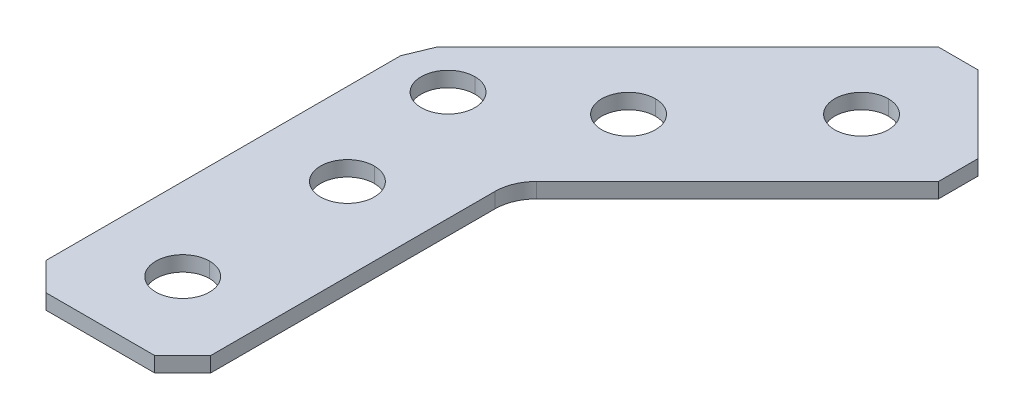
ISO-10303-21;
HEADER;
FILE_DESCRIPTION(('STEP AP214'),'2;1');
FILE_NAME('part.step','',(''),(''),'','','');
FILE_SCHEMA(('AUTOMOTIVE_DESIGN { 1 0 10303 214 1 1 1 1 }'));
ENDSEC;
DATA;
#1=APPLICATION_CONTEXT('core data for automotive mechanical design processes');
#2=APPLICATION_PROTOCOL_DEFINITION('international standard','automotive_design',2000,#1);
#3=PRODUCT_CONTEXT('',#1,'mechanical');
#4=PRODUCT('Part','Part','',(#3));
#5=PRODUCT_RELATED_PRODUCT_CATEGORY('part','',(#4));
#6=PRODUCT_DEFINITION_FORMATION('','',#4);
#7=PRODUCT_DEFINITION_CONTEXT('part definition',#1,'design');
#8=PRODUCT_DEFINITION('design','',#6,#7);
#9=PRODUCT_DEFINITION_SHAPE('','',#8);
#10=(LENGTH_UNIT() NAMED_UNIT(*) SI_UNIT(.MILLI.,.METRE.));
#11=(NAMED_UNIT(*) PLANE_ANGLE_UNIT() SI_UNIT($,.RADIAN.));
#12=(NAMED_UNIT(*) SI_UNIT($,.STERADIAN.) SOLID_ANGLE_UNIT());
#13=UNCERTAINTY_MEASURE_WITH_UNIT(LENGTH_MEASURE(1.E-05),#10,'distance_accuracy_value','');
#14=(GEOMETRIC_REPRESENTATION_CONTEXT(3) GLOBAL_UNCERTAINTY_ASSIGNED_CONTEXT((#13)) GLOBAL_UNIT_ASSIGNED_CONTEXT((#10,
#11,#12)) REPRESENTATION_CONTEXT('',''));
#15=CARTESIAN_POINT('',(0.,0.,0.));
#16=DIRECTION('',(0.,0.,1.));
#17=DIRECTION('',(1.,0.,0.));
#18=AXIS2_PLACEMENT_3D('',#15,#16,#17);
#19=CARTESIAN_POINT('',(-4.191,1.1684,12.7));
#20=DIRECTION('',(0.707106781186549,0.,-0.707106781186546));
#21=DIRECTION('',(0.,-1.,0.));
#22=AXIS2_PLACEMENT_3D('',#19,#20,#21);
#23=PLANE('',#22);
#24=DIRECTION('',(0.707106781186547,0.,0.707106781186549));
#25=VECTOR('',#24,1.);
#26=CARTESIAN_POINT('',(-4.191,1.1684,12.7));
#27=LINE('',#26,#25);
#28=CARTESIAN_POINT('',(-6.35,1.1684,10.541));
#29=VERTEX_POINT('',#28);
#30=CARTESIAN_POINT('',(-4.191,1.1684,12.7));
#31=VERTEX_POINT('',#30);
#32=EDGE_CURVE('E223',#29,#31,#27,.T.);
#33=ORIENTED_EDGE('',*,*,#32,.F.);
#34=DIRECTION('',(0.,1.,0.));
#35=VECTOR('',#34,1.);
#36=CARTESIAN_POINT('',(-6.35,1.1684,10.541));
#37=LINE('',#36,#35);
#38=CARTESIAN_POINT('',(-6.35,0.,10.541));
#39=VERTEX_POINT('',#38);
#40=EDGE_CURVE('E313',#39,#29,#37,.T.);
#41=ORIENTED_EDGE('',*,*,#40,.F.);
#42=DIRECTION('',(-0.707106781186547,0.,-0.707106781186549));
#43=VECTOR('',#42,1.);
#44=CARTESIAN_POINT('',(-5.2705,0.,11.6205));
#45=LINE('',#44,#43);
#46=CARTESIAN_POINT('',(-4.191,0.,12.7));
#47=VERTEX_POINT('',#46);
#48=EDGE_CURVE('E226',#47,#39,#45,.T.);
#49=ORIENTED_EDGE('',*,*,#48,.F.);
#50=DIRECTION('',(0.,-1.,0.));
#51=VECTOR('',#50,1.);
#52=CARTESIAN_POINT('',(-4.191,1.1684,12.7));
#53=LINE('',#52,#51);
#54=EDGE_CURVE('E10',#31,#47,#53,.T.);
#55=ORIENTED_EDGE('',*,*,#54,.F.);
#56=EDGE_LOOP('',(#33,#41,#49,#55));
#57=FACE_BOUND('',#56,.T.);
#58=ADVANCED_FACE('F15',(#57),#23,.F.);
#59=CARTESIAN_POINT('',(-6.35,1.1684,12.7));
#60=DIRECTION('',(0.,0.,-1.));
#61=DIRECTION('',(0.,-1.,0.));
#62=AXIS2_PLACEMENT_3D('',#59,#60,#61);
#63=PLANE('',#62);
#64=DIRECTION('',(1.,0.,0.));
#65=VECTOR('',#64,1.);
#66=CARTESIAN_POINT('',(-6.35,1.1684,12.7));
#67=LINE('',#66,#65);
#68=CARTESIAN_POINT('',(4.191,1.1684,12.7));
#69=VERTEX_POINT('',#68);
#70=EDGE_CURVE('E231',#31,#69,#67,.T.);
#71=ORIENTED_EDGE('',*,*,#70,.F.);
#72=ORIENTED_EDGE('',*,*,#54,.T.);
#73=DIRECTION('',(1.,0.,0.));
#74=VECTOR('',#73,1.);
#75=CARTESIAN_POINT('',(-6.35,0.,12.7));
#76=LINE('',#75,#74);
#77=CARTESIAN_POINT('',(4.191,0.,12.7));
#78=VERTEX_POINT('',#77);
#79=EDGE_CURVE('E264',#47,#78,#76,.T.);
#80=ORIENTED_EDGE('',*,*,#79,.T.);
#81=DIRECTION('',(0.,1.,0.));
#82=VECTOR('',#81,1.);
#83=CARTESIAN_POINT('',(4.191,1.1684,12.7));
#84=LINE('',#83,#82);
#85=EDGE_CURVE('E233',#78,#69,#84,.T.);
#86=ORIENTED_EDGE('',*,*,#85,.T.);
#87=EDGE_LOOP('',(#71,#72,#80,#86));
#88=FACE_BOUND('',#87,.T.);
#89=ADVANCED_FACE('F232',(#88),#63,.F.);
#90=CARTESIAN_POINT('',(9.525,1.1684,-11.3848719394654));
#91=DIRECTION('',(0.,1.,0.));
#92=DIRECTION('',(0.,0.,1.));
#93=AXIS2_PLACEMENT_3D('',#90,#91,#92);
#94=CYLINDRICAL_SURFACE('',#93,3.175);
#95=CARTESIAN_POINT('',(9.525,1.1684,-11.3848719394654));
#96=DIRECTION('',(0.,-1.,0.));
#97=DIRECTION('',(0.,0.,-1.));
#98=AXIS2_PLACEMENT_3D('',#95,#96,#97);
#99=CIRCLE('',#98,3.175);
#100=CARTESIAN_POINT('',(6.35,1.1684,-11.3848719394654));
#101=VERTEX_POINT('',#100);
#102=CARTESIAN_POINT('',(7.27993596973271,1.1684,-13.6299359697327));
#103=VERTEX_POINT('',#102);
#104=EDGE_CURVE('E385',#101,#103,#99,.T.);
#105=ORIENTED_EDGE('',*,*,#104,.F.);
#106=DIRECTION('',(0.,1.,0.));
#107=VECTOR('',#106,1.);
#108=CARTESIAN_POINT('',(6.35,1.1684,-11.3848719394654));
#109=LINE('',#108,#107);
#110=CARTESIAN_POINT('',(6.35,0.,-11.3848719394654));
#111=VERTEX_POINT('',#110);
#112=EDGE_CURVE('E415',#111,#101,#109,.T.);
#113=ORIENTED_EDGE('',*,*,#112,.F.);
#114=CARTESIAN_POINT('',(9.525,0.,-11.3848719394654));
#115=DIRECTION('',(0.,1.,0.));
#116=DIRECTION('',(0.,0.,-1.));
#117=AXIS2_PLACEMENT_3D('',#114,#115,#116);
#118=CIRCLE('',#117,3.175);
#119=CARTESIAN_POINT('',(7.27993596973271,0.,-13.6299359697327));
#120=VERTEX_POINT('',#119);
#121=EDGE_CURVE('E326',#120,#111,#118,.T.);
#122=ORIENTED_EDGE('',*,*,#121,.F.);
#123=DIRECTION('',(0.,-1.,0.));
#124=VECTOR('',#123,1.);
#125=CARTESIAN_POINT('',(7.27993596973272,0.,-13.6299359697327));
#126=LINE('',#125,#124);
#127=EDGE_CURVE('E379',#103,#120,#126,.T.);
#128=ORIENTED_EDGE('',*,*,#127,.F.);
#129=EDGE_LOOP('',(#105,#113,#122,#128));
#130=FACE_BOUND('',#129,.T.);
#131=ADVANCED_FACE('F476',(#130),#94,.F.);
#132=CARTESIAN_POINT('',(-2.08546691384424,1.1684,-16.1940848006638));
#133=DIRECTION('',(0.,-1.,0.));
#134=DIRECTION('',(0.,0.,-1.));
#135=AXIS2_PLACEMENT_3D('',#132,#133,#134);
#136=CYLINDRICAL_SURFACE('',#135,2.0701);
#137=CARTESIAN_POINT('',(-2.08546691384424,1.1684,-16.1940848006638));
#138=DIRECTION('',(0.,1.,0.));
#139=DIRECTION('',(0.,0.,1.));
#140=AXIS2_PLACEMENT_3D('',#137,#138,#139);
#141=CIRCLE('',#140,2.0701);
#142=CARTESIAN_POINT('',(-2.08546691384424,1.1684,-18.2641848006638));
#143=VERTEX_POINT('',#142);
#144=CARTESIAN_POINT('',(-2.08546691384424,1.1684,-14.1239848006638));
#145=VERTEX_POINT('',#144);
#146=EDGE_CURVE('E346',#143,#145,#141,.T.);
#147=ORIENTED_EDGE('',*,*,#146,.T.);
#148=DIRECTION('',(0.,-1.,0.));
#149=VECTOR('',#148,1.);
#150=CARTESIAN_POINT('',(-2.08546691384424,1.1684,-14.1239848006638));
#151=LINE('',#150,#149);
#152=CARTESIAN_POINT('',(-2.08546691384424,0.,-14.1239848006638));
#153=VERTEX_POINT('',#152);
#154=EDGE_CURVE('E376',#145,#153,#151,.T.);
#155=ORIENTED_EDGE('',*,*,#154,.T.);
#156=CARTESIAN_POINT('',(-2.08546691384424,0.,-16.1940848006638));
#157=DIRECTION('',(0.,1.,0.));
#158=DIRECTION('',(0.,0.,1.));
#159=AXIS2_PLACEMENT_3D('',#156,#157,#158);
#160=CIRCLE('',#159,2.0701);
#161=CARTESIAN_POINT('',(-2.08546691384424,0.,-18.2641848006638));
#162=VERTEX_POINT('',#161);
#163=EDGE_CURVE('E370',#162,#153,#160,.T.);
#164=ORIENTED_EDGE('',*,*,#163,.F.);
#165=DIRECTION('',(0.,-1.,0.));
#166=VECTOR('',#165,1.);
#167=CARTESIAN_POINT('',(-2.08546691384424,1.1684,-18.2641848006638));
#168=LINE('',#167,#166);
#169=EDGE_CURVE('E26',#143,#162,#168,.T.);
#170=ORIENTED_EDGE('',*,*,#169,.F.);
#171=EDGE_LOOP('',(#147,#155,#164,#170));
#172=FACE_BOUND('',#171,.T.);
#173=ADVANCED_FACE('F520',(#172),#136,.F.);
#174=CARTESIAN_POINT('',(6.35,1.1684,-21.6802561210692));
#175=DIRECTION('',(0.,-1.,0.));
#176=DIRECTION('',(0.,0.,-1.));
#177=AXIS2_PLACEMENT_3D('',#174,#175,#176);
#178=CYLINDRICAL_SURFACE('',#177,2.0701);
#179=CARTESIAN_POINT('',(6.35,1.1684,-21.6802561210692));
#180=DIRECTION('',(0.,1.,0.));
#181=DIRECTION('',(0.,0.,1.));
#182=AXIS2_PLACEMENT_3D('',#179,#180,#181);
#183=CIRCLE('',#182,2.0701);
#184=CARTESIAN_POINT('',(6.35,1.1684,-23.7503561210692));
#185=VERTEX_POINT('',#184);
#186=CARTESIAN_POINT('',(6.35,1.1684,-19.6101561210692));
#187=VERTEX_POINT('',#186);
#188=EDGE_CURVE('E259',#185,#187,#183,.T.);
#189=ORIENTED_EDGE('',*,*,#188,.T.);
#190=DIRECTION('',(0.,-1.,0.));
#191=VECTOR('',#190,1.);
#192=CARTESIAN_POINT('',(6.35,1.1684,-19.6101561210692));
#193=LINE('',#192,#191);
#194=CARTESIAN_POINT('',(6.35,0.,-19.6101561210692));
#195=VERTEX_POINT('',#194);
#196=EDGE_CURVE('E276',#187,#195,#193,.T.);
#197=ORIENTED_EDGE('',*,*,#196,.T.);
#198=CARTESIAN_POINT('',(6.35,0.,-21.6802561210692));
#199=DIRECTION('',(0.,1.,0.));
#200=DIRECTION('',(0.,0.,1.));
#201=AXIS2_PLACEMENT_3D('',#198,#199,#200);
#202=CIRCLE('',#201,2.0701);
#203=CARTESIAN_POINT('',(6.35,0.,-23.7503561210692));
#204=VERTEX_POINT('',#203);
#205=EDGE_CURVE('E285',#204,#195,#202,.T.);
#206=ORIENTED_EDGE('',*,*,#205,.F.);
#207=DIRECTION('',(0.,-1.,0.));
#208=VECTOR('',#207,1.);
#209=CARTESIAN_POINT('',(6.35,1.1684,-23.7503561210692));
#210=LINE('',#209,#208);
#211=EDGE_CURVE('E278',#185,#204,#210,.T.);
#212=ORIENTED_EDGE('',*,*,#211,.F.);
#213=EDGE_LOOP('',(#189,#197,#206,#212));
#214=FACE_BOUND('',#213,.T.);
#215=ADVANCED_FACE('F523',(#214),#178,.F.);
#216=CARTESIAN_POINT('',(-2.08546691384424,1.1684,-16.1940848006638));
#217=DIRECTION('',(0.,-1.,0.));
#218=DIRECTION('',(0.,0.,-1.));
#219=AXIS2_PLACEMENT_3D('',#216,#217,#218);
#220=CYLINDRICAL_SURFACE('',#219,2.0701);
#221=ORIENTED_EDGE('',*,*,#154,.F.);
#222=CARTESIAN_POINT('',(-2.08546691384424,1.1684,-16.1940848006638));
#223=DIRECTION('',(0.,1.,0.));
#224=DIRECTION('',(0.,0.,1.));
#225=AXIS2_PLACEMENT_3D('',#222,#223,#224);
#226=CIRCLE('',#225,2.0701);
#227=EDGE_CURVE('E393',#145,#143,#226,.T.);
#228=ORIENTED_EDGE('',*,*,#227,.T.);
#229=ORIENTED_EDGE('',*,*,#169,.T.);
#230=CARTESIAN_POINT('',(-2.08546691384424,0.,-16.1940848006638));
#231=DIRECTION('',(0.,1.,0.));
#232=DIRECTION('',(0.,0.,1.));
#233=AXIS2_PLACEMENT_3D('',#230,#231,#232);
#234=CIRCLE('',#233,2.0701);
#235=EDGE_CURVE('E254',#153,#162,#234,.T.);
#236=ORIENTED_EDGE('',*,*,#235,.F.);
#237=EDGE_LOOP('',(#221,#228,#229,#236));
#238=FACE_BOUND('',#237,.T.);
#239=ADVANCED_FACE('F525',(#238),#220,.F.);
#240=CARTESIAN_POINT('',(0.,1.1684,6.35));
#241=DIRECTION('',(0.,-1.,0.));
#242=DIRECTION('',(0.,0.,-1.));
#243=AXIS2_PLACEMENT_3D('',#240,#241,#242);
#244=CYLINDRICAL_SURFACE('',#243,2.0701);
#245=CARTESIAN_POINT('',(0.,1.1684,6.35));
#246=DIRECTION('',(0.,1.,0.));
#247=DIRECTION('',(0.,0.,1.));
#248=AXIS2_PLACEMENT_3D('',#245,#246,#247);
#249=CIRCLE('',#248,2.0701);
#250=CARTESIAN_POINT('',(0.,1.1684,4.2799));
#251=VERTEX_POINT('',#250);
#252=CARTESIAN_POINT('',(0.,1.1684,8.4201));
#253=VERTEX_POINT('',#252);
#254=EDGE_CURVE('E347',#251,#253,#249,.T.);
#255=ORIENTED_EDGE('',*,*,#254,.T.);
#256=DIRECTION('',(0.,-1.,0.));
#257=VECTOR('',#256,1.);
#258=CARTESIAN_POINT('',(0.,1.1684,8.4201));
#259=LINE('',#258,#257);
#260=CARTESIAN_POINT('',(0.,0.,8.4201));
#261=VERTEX_POINT('',#260);
#262=EDGE_CURVE('E312',#253,#261,#259,.T.);
#263=ORIENTED_EDGE('',*,*,#262,.T.);
#264=CARTESIAN_POINT('',(0.,0.,6.35));
#265=DIRECTION('',(0.,1.,0.));
#266=DIRECTION('',(0.,0.,1.));
#267=AXIS2_PLACEMENT_3D('',#264,#265,#266);
#268=CIRCLE('',#267,2.0701);
#269=CARTESIAN_POINT('',(0.,0.,4.2799));
#270=VERTEX_POINT('',#269);
#271=EDGE_CURVE('E284',#270,#261,#268,.T.);
#272=ORIENTED_EDGE('',*,*,#271,.F.);
#273=DIRECTION('',(0.,-1.,0.));
#274=VECTOR('',#273,1.);
#275=CARTESIAN_POINT('',(0.,1.1684,4.2799));
#276=LINE('',#275,#274);
#277=EDGE_CURVE('E319',#251,#270,#276,.T.);
#278=ORIENTED_EDGE('',*,*,#277,.F.);
#279=EDGE_LOOP('',(#255,#263,#272,#278));
#280=FACE_BOUND('',#279,.T.);
#281=ADVANCED_FACE('F528',(#280),#244,.F.);
#282=CARTESIAN_POINT('',(15.3302561210692,1.1684,-30.6605122421383));
#283=DIRECTION('',(0.,-1.,0.));
#284=DIRECTION('',(0.,0.,-1.));
#285=AXIS2_PLACEMENT_3D('',#282,#283,#284);
#286=CYLINDRICAL_SURFACE('',#285,2.0701);
#287=DIRECTION('',(0.,-1.,0.));
#288=VECTOR('',#287,1.);
#289=CARTESIAN_POINT('',(15.3302561210692,1.1684,-28.5904122421383));
#290=LINE('',#289,#288);
#291=CARTESIAN_POINT('',(15.3302561210692,1.1684,-28.5904122421383));
#292=VERTEX_POINT('',#291);
#293=CARTESIAN_POINT('',(15.3302561210692,0.,-28.5904122421383));
#294=VERTEX_POINT('',#293);
#295=EDGE_CURVE('E41',#292,#294,#290,.T.);
#296=ORIENTED_EDGE('',*,*,#295,.F.);
#297=CARTESIAN_POINT('',(15.3302561210692,1.1684,-30.6605122421383));
#298=DIRECTION('',(0.,1.,0.));
#299=DIRECTION('',(0.,0.,1.));
#300=AXIS2_PLACEMENT_3D('',#297,#298,#299);
#301=CIRCLE('',#300,2.0701);
#302=CARTESIAN_POINT('',(15.3302561210692,1.1684,-32.7306122421383));
#303=VERTEX_POINT('',#302);
#304=EDGE_CURVE('E333',#292,#303,#301,.T.);
#305=ORIENTED_EDGE('',*,*,#304,.T.);
#306=DIRECTION('',(0.,-1.,0.));
#307=VECTOR('',#306,1.);
#308=CARTESIAN_POINT('',(15.3302561210692,1.1684,-32.7306122421383));
#309=LINE('',#308,#307);
#310=CARTESIAN_POINT('',(15.3302561210692,0.,-32.7306122421383));
#311=VERTEX_POINT('',#310);
#312=EDGE_CURVE('E273',#303,#311,#309,.T.);
#313=ORIENTED_EDGE('',*,*,#312,.T.);
#314=CARTESIAN_POINT('',(15.3302561210692,0.,-30.6605122421383));
#315=DIRECTION('',(0.,1.,0.));
#316=DIRECTION('',(0.,0.,1.));
#317=AXIS2_PLACEMENT_3D('',#314,#315,#316);
#318=CIRCLE('',#317,2.0701);
#319=EDGE_CURVE('E297',#294,#311,#318,.T.);
#320=ORIENTED_EDGE('',*,*,#319,.F.);
#321=EDGE_LOOP('',(#296,#305,#313,#320));
#322=FACE_BOUND('',#321,.T.);
#323=ADVANCED_FACE('F510',(#322),#286,.F.);
#324=CARTESIAN_POINT('',(24.3105122421383,1.1684,-30.6605122421382));
#325=DIRECTION('',(-0.707106781186546,0.,-0.707106781186549));
#326=DIRECTION('',(-0.707106781186549,0.,0.707106781186546));
#327=AXIS2_PLACEMENT_3D('',#324,#325,#326);
#328=PLANE('',#327);
#329=DIRECTION('',(0.707106781186549,0.,-0.707106781186546));
#330=VECTOR('',#329,1.);
#331=CARTESIAN_POINT('',(24.3105122421383,0.,-30.6605122421382));
#332=LINE('',#331,#330);
#333=CARTESIAN_POINT('',(22.7838687015565,0.,-29.1338687015565));
#334=VERTEX_POINT('',#333);
#335=EDGE_CURVE('E289',#120,#334,#332,.T.);
#336=ORIENTED_EDGE('',*,*,#335,.T.);
#337=DIRECTION('',(0.,1.,0.));
#338=VECTOR('',#337,1.);
#339=CARTESIAN_POINT('',(22.7838687015565,1.1684,-29.1338687015565));
#340=LINE('',#339,#338);
#341=CARTESIAN_POINT('',(22.7838687015565,1.1684,-29.1338687015565));
#342=VERTEX_POINT('',#341);
#343=EDGE_CURVE('E339',#334,#342,#340,.T.);
#344=ORIENTED_EDGE('',*,*,#343,.T.);
#345=DIRECTION('',(0.707106781186549,0.,-0.707106781186546));
#346=VECTOR('',#345,1.);
#347=CARTESIAN_POINT('',(24.3105122421383,1.1684,-30.6605122421382));
#348=LINE('',#347,#346);
#349=EDGE_CURVE('E293',#103,#342,#348,.T.);
#350=ORIENTED_EDGE('',*,*,#349,.F.);
#351=ORIENTED_EDGE('',*,*,#127,.T.);
#352=EDGE_LOOP('',(#336,#344,#350,#351));
#353=FACE_BOUND('',#352,.T.);
#354=ADVANCED_FACE('F468',(#353),#328,.F.);
#355=CARTESIAN_POINT('',(6.35,1.1684,-12.7));
#356=DIRECTION('',(-1.,0.,0.));
#357=DIRECTION('',(0.,1.,0.));
#358=AXIS2_PLACEMENT_3D('',#355,#356,#357);
#359=PLANE('',#358);
#360=DIRECTION('',(0.,0.,-1.));
#361=VECTOR('',#360,1.);
#362=CARTESIAN_POINT('',(6.35,1.1684,-12.7));
#363=LINE('',#362,#361);
#364=CARTESIAN_POINT('',(6.35,1.1684,10.541));
#365=VERTEX_POINT('',#364);
#366=EDGE_CURVE('E365',#365,#101,#363,.T.);
#367=ORIENTED_EDGE('',*,*,#366,.F.);
#368=DIRECTION('',(0.,-1.,0.));
#369=VECTOR('',#368,1.);
#370=CARTESIAN_POINT('',(6.35,1.1684,10.541));
#371=LINE('',#370,#369);
#372=CARTESIAN_POINT('',(6.35,0.,10.541));
#373=VERTEX_POINT('',#372);
#374=EDGE_CURVE('E19',#365,#373,#371,.T.);
#375=ORIENTED_EDGE('',*,*,#374,.T.);
#376=DIRECTION('',(0.,0.,-1.));
#377=VECTOR('',#376,1.);
#378=CARTESIAN_POINT('',(6.35,0.,-12.7));
#379=LINE('',#378,#377);
#380=EDGE_CURVE('E322',#373,#111,#379,.T.);
#381=ORIENTED_EDGE('',*,*,#380,.T.);
#382=ORIENTED_EDGE('',*,*,#112,.T.);
#383=EDGE_LOOP('',(#367,#375,#381,#382));
#384=FACE_BOUND('',#383,.T.);
#385=ADVANCED_FACE('F501',(#384),#359,.F.);
#386=CARTESIAN_POINT('',(6.35,1.1684,10.541));
#387=DIRECTION('',(-0.707106781186546,0.,-0.707106781186549));
#388=DIRECTION('',(-0.707106781186549,0.,0.707106781186546));
#389=AXIS2_PLACEMENT_3D('',#386,#387,#388);
#390=PLANE('',#389);
#391=DIRECTION('',(0.707106781186549,0.,-0.707106781186546));
#392=VECTOR('',#391,1.);
#393=CARTESIAN_POINT('',(6.35,1.1684,10.541));
#394=LINE('',#393,#392);
#395=EDGE_CURVE('E237',#69,#365,#394,.T.);
#396=ORIENTED_EDGE('',*,*,#395,.F.);
#397=ORIENTED_EDGE('',*,*,#85,.F.);
#398=DIRECTION('',(-0.707106781186549,0.,0.707106781186546));
#399=VECTOR('',#398,1.);
#400=CARTESIAN_POINT('',(-1.0795,0.,17.9705));
#401=LINE('',#400,#399);
#402=EDGE_CURVE('E267',#373,#78,#401,.T.);
#403=ORIENTED_EDGE('',*,*,#402,.F.);
#404=ORIENTED_EDGE('',*,*,#374,.F.);
#405=EDGE_LOOP('',(#396,#397,#403,#404));
#406=FACE_BOUND('',#405,.T.);
#407=ADVANCED_FACE('F499',(#406),#390,.F.);
#408=CARTESIAN_POINT('',(6.35,1.1684,-21.6802561210692));
#409=DIRECTION('',(0.,-1.,0.));
#410=DIRECTION('',(0.,0.,-1.));
#411=AXIS2_PLACEMENT_3D('',#408,#409,#410);
#412=CYLINDRICAL_SURFACE('',#411,2.0701);
#413=ORIENTED_EDGE('',*,*,#196,.F.);
#414=CARTESIAN_POINT('',(6.35,1.1684,-21.6802561210692));
#415=DIRECTION('',(0.,1.,0.));
#416=DIRECTION('',(0.,0.,1.));
#417=AXIS2_PLACEMENT_3D('',#414,#415,#416);
#418=CIRCLE('',#417,2.0701);
#419=EDGE_CURVE('E263',#187,#185,#418,.T.);
#420=ORIENTED_EDGE('',*,*,#419,.T.);
#421=ORIENTED_EDGE('',*,*,#211,.T.);
#422=CARTESIAN_POINT('',(6.35,0.,-21.6802561210692));
#423=DIRECTION('',(0.,1.,0.));
#424=DIRECTION('',(0.,0.,1.));
#425=AXIS2_PLACEMENT_3D('',#422,#423,#424);
#426=CIRCLE('',#425,2.0701);
#427=EDGE_CURVE('E280',#195,#204,#426,.T.);
#428=ORIENTED_EDGE('',*,*,#427,.F.);
#429=EDGE_LOOP('',(#413,#420,#421,#428));
#430=FACE_BOUND('',#429,.T.);
#431=ADVANCED_FACE('F17',(#430),#412,.F.);
#432=CARTESIAN_POINT('',(0.,1.1684,-6.35000000000009));
#433=DIRECTION('',(0.,-1.,0.));
#434=DIRECTION('',(0.,0.,-1.));
#435=AXIS2_PLACEMENT_3D('',#432,#433,#434);
#436=CYLINDRICAL_SURFACE('',#435,2.0701);
#437=DIRECTION('',(0.,-1.,0.));
#438=VECTOR('',#437,1.);
#439=CARTESIAN_POINT('',(0.,1.1684,-4.27990000000011));
#440=LINE('',#439,#438);
#441=CARTESIAN_POINT('',(0.,1.1684,-4.27990000000011));
#442=VERTEX_POINT('',#441);
#443=CARTESIAN_POINT('',(0.,0.,-4.27990000000011));
#444=VERTEX_POINT('',#443);
#445=EDGE_CURVE('E338',#442,#444,#440,.T.);
#446=ORIENTED_EDGE('',*,*,#445,.F.);
#447=CARTESIAN_POINT('',(0.,1.1684,-6.35000000000009));
#448=DIRECTION('',(0.,1.,0.));
#449=DIRECTION('',(0.,0.,1.));
#450=AXIS2_PLACEMENT_3D('',#447,#448,#449);
#451=CIRCLE('',#450,2.0701);
#452=CARTESIAN_POINT('',(0.,1.1684,-8.4201));
#453=VERTEX_POINT('',#452);
#454=EDGE_CURVE('E334',#442,#453,#451,.T.);
#455=ORIENTED_EDGE('',*,*,#454,.T.);
#456=DIRECTION('',(0.,-1.,0.));
#457=VECTOR('',#456,1.);
#458=CARTESIAN_POINT('',(0.,1.1684,-8.4201));
#459=LINE('',#458,#457);
#460=CARTESIAN_POINT('',(0.,0.,-8.4201));
#461=VERTEX_POINT('',#460);
#462=EDGE_CURVE('E342',#453,#461,#459,.T.);
#463=ORIENTED_EDGE('',*,*,#462,.T.);
#464=CARTESIAN_POINT('',(0.,0.,-6.35000000000009));
#465=DIRECTION('',(0.,1.,0.));
#466=DIRECTION('',(0.,0.,1.));
#467=AXIS2_PLACEMENT_3D('',#464,#465,#466);
#468=CIRCLE('',#467,2.0701);
#469=EDGE_CURVE('E314',#444,#461,#468,.T.);
#470=ORIENTED_EDGE('',*,*,#469,.F.);
#471=EDGE_LOOP('',(#446,#455,#463,#470));
#472=FACE_BOUND('',#471,.T.);
#473=ADVANCED_FACE('F538',(#472),#436,.F.);
#474=CARTESIAN_POINT('',(15.3302561210692,1.1684,-30.6605122421383));
#475=DIRECTION('',(0.,-1.,0.));
#476=DIRECTION('',(0.,0.,-1.));
#477=AXIS2_PLACEMENT_3D('',#474,#475,#476);
#478=CYLINDRICAL_SURFACE('',#477,2.0701);
#479=CARTESIAN_POINT('',(15.3302561210692,1.1684,-30.6605122421383));
#480=DIRECTION('',(0.,1.,0.));
#481=DIRECTION('',(0.,0.,1.));
#482=AXIS2_PLACEMENT_3D('',#479,#480,#481);
#483=CIRCLE('',#482,2.0701);
#484=EDGE_CURVE('E329',#303,#292,#483,.T.);
#485=ORIENTED_EDGE('',*,*,#484,.T.);
#486=ORIENTED_EDGE('',*,*,#295,.T.);
#487=CARTESIAN_POINT('',(15.3302561210692,0.,-30.6605122421383));
#488=DIRECTION('',(0.,1.,0.));
#489=DIRECTION('',(0.,0.,1.));
#490=AXIS2_PLACEMENT_3D('',#487,#488,#489);
#491=CIRCLE('',#490,2.0701);
#492=EDGE_CURVE('E302',#311,#294,#491,.T.);
#493=ORIENTED_EDGE('',*,*,#492,.F.);
#494=ORIENTED_EDGE('',*,*,#312,.F.);
#495=EDGE_LOOP('',(#485,#486,#493,#494));
#496=FACE_BOUND('',#495,.T.);
#497=ADVANCED_FACE('F534',(#496),#478,.F.);
#498=CARTESIAN_POINT('',(0.,1.1684,6.35));
#499=DIRECTION('',(0.,-1.,0.));
#500=DIRECTION('',(0.,0.,-1.));
#501=AXIS2_PLACEMENT_3D('',#498,#499,#500);
#502=CYLINDRICAL_SURFACE('',#501,2.0701);
#503=ORIENTED_EDGE('',*,*,#262,.F.);
#504=CARTESIAN_POINT('',(0.,1.1684,6.35));
#505=DIRECTION('',(0.,1.,0.));
#506=DIRECTION('',(0.,0.,1.));
#507=AXIS2_PLACEMENT_3D('',#504,#505,#506);
#508=CIRCLE('',#507,2.0701);
#509=EDGE_CURVE('E343',#253,#251,#508,.T.);
#510=ORIENTED_EDGE('',*,*,#509,.T.);
#511=ORIENTED_EDGE('',*,*,#277,.T.);
#512=CARTESIAN_POINT('',(0.,0.,6.35));
#513=DIRECTION('',(0.,1.,0.));
#514=DIRECTION('',(0.,0.,1.));
#515=AXIS2_PLACEMENT_3D('',#512,#513,#514);
#516=CIRCLE('',#515,2.0701);
#517=EDGE_CURVE('E366',#261,#270,#516,.T.);
#518=ORIENTED_EDGE('',*,*,#517,.F.);
#519=EDGE_LOOP('',(#503,#510,#511,#518));
#520=FACE_BOUND('',#519,.T.);
#521=ADVANCED_FACE('F537',(#520),#502,.F.);
#522=CARTESIAN_POINT('',(-6.35,1.1684,-16.7920698619227));
#523=DIRECTION('',(0.923879532511287,0.,0.382683432365091));
#524=DIRECTION('',(0.,-1.,0.));
#525=AXIS2_PLACEMENT_3D('',#522,#523,#524);
#526=PLANE('',#525);
#527=DIRECTION('',(-0.382683432365091,0.,0.923879532511287));
#528=VECTOR('',#527,1.);
#529=CARTESIAN_POINT('',(-6.35,0.,-16.7920698619227));
#530=LINE('',#529,#528);
#531=CARTESIAN_POINT('',(-5.52378646952377,0.,-18.7867257726145));
#532=VERTEX_POINT('',#531);
#533=CARTESIAN_POINT('',(-6.35,0.,-16.7920698619227));
#534=VERTEX_POINT('',#533);
#535=EDGE_CURVE('E401',#532,#534,#530,.T.);
#536=ORIENTED_EDGE('',*,*,#535,.T.);
#537=DIRECTION('',(0.,-1.,0.));
#538=VECTOR('',#537,1.);
#539=CARTESIAN_POINT('',(-6.35,1.1684,-16.7920698619227));
#540=LINE('',#539,#538);
#541=CARTESIAN_POINT('',(-6.35,1.1684,-16.7920698619227));
#542=VERTEX_POINT('',#541);
#543=EDGE_CURVE('E309',#542,#534,#540,.T.);
#544=ORIENTED_EDGE('',*,*,#543,.F.);
#545=DIRECTION('',(-0.382683432365091,0.,0.923879532511287));
#546=VECTOR('',#545,1.);
#547=CARTESIAN_POINT('',(-6.35,1.1684,-16.7920698619227));
#548=LINE('',#547,#546);
#549=CARTESIAN_POINT('',(-5.52378646952377,1.1684,-18.7867257726145));
#550=VERTEX_POINT('',#549);
#551=EDGE_CURVE('E250',#550,#542,#548,.T.);
#552=ORIENTED_EDGE('',*,*,#551,.F.);
#553=DIRECTION('',(0.,-1.,0.));
#554=VECTOR('',#553,1.);
#555=CARTESIAN_POINT('',(-5.52378646952377,1.1684,-18.7867257726145));
#556=LINE('',#555,#554);
#557=EDGE_CURVE('E335',#550,#532,#556,.T.);
#558=ORIENTED_EDGE('',*,*,#557,.T.);
#559=EDGE_LOOP('',(#536,#544,#552,#558));
#560=FACE_BOUND('',#559,.T.);
#561=ADVANCED_FACE('F494',(#560),#526,.F.);
#562=CARTESIAN_POINT('',(-6.35,1.1684,-12.7));
#563=DIRECTION('',(1.,0.,0.));
#564=DIRECTION('',(0.,1.,0.));
#565=AXIS2_PLACEMENT_3D('',#562,#563,#564);
#566=PLANE('',#565);
#567=DIRECTION('',(0.,0.,1.));
#568=VECTOR('',#567,1.);
#569=CARTESIAN_POINT('',(-6.35,0.,-12.7));
#570=LINE('',#569,#568);
#571=EDGE_CURVE('E295',#534,#39,#570,.T.);
#572=ORIENTED_EDGE('',*,*,#571,.T.);
#573=ORIENTED_EDGE('',*,*,#40,.T.);
#574=DIRECTION('',(0.,0.,1.));
#575=VECTOR('',#574,1.);
#576=CARTESIAN_POINT('',(-6.35,1.1684,-12.7));
#577=LINE('',#576,#575);
#578=EDGE_CURVE('E242',#542,#29,#577,.T.);
#579=ORIENTED_EDGE('',*,*,#578,.F.);
#580=ORIENTED_EDGE('',*,*,#543,.T.);
#581=EDGE_LOOP('',(#572,#573,#579,#580));
#582=FACE_BOUND('',#581,.T.);
#583=ADVANCED_FACE('F496',(#582),#566,.F.);
#584=CARTESIAN_POINT('',(0.,1.1684,-6.35000000000009));
#585=DIRECTION('',(0.,-1.,0.));
#586=DIRECTION('',(0.,0.,-1.));
#587=AXIS2_PLACEMENT_3D('',#584,#585,#586);
#588=CYLINDRICAL_SURFACE('',#587,2.0701);
#589=CARTESIAN_POINT('',(0.,1.1684,-6.35000000000009));
#590=DIRECTION('',(0.,1.,0.));
#591=DIRECTION('',(0.,0.,1.));
#592=AXIS2_PLACEMENT_3D('',#589,#590,#591);
#593=CIRCLE('',#592,2.0701);
#594=EDGE_CURVE('E397',#453,#442,#593,.T.);
#595=ORIENTED_EDGE('',*,*,#594,.T.);
#596=ORIENTED_EDGE('',*,*,#445,.T.);
#597=CARTESIAN_POINT('',(0.,0.,-6.35000000000009));
#598=DIRECTION('',(0.,1.,0.));
#599=DIRECTION('',(0.,0.,1.));
#600=AXIS2_PLACEMENT_3D('',#597,#598,#599);
#601=CIRCLE('',#600,2.0701);
#602=EDGE_CURVE('E318',#461,#444,#601,.T.);
#603=ORIENTED_EDGE('',*,*,#602,.F.);
#604=ORIENTED_EDGE('',*,*,#462,.F.);
#605=EDGE_LOOP('',(#595,#596,#603,#604));
#606=FACE_BOUND('',#605,.T.);
#607=ADVANCED_FACE('F530',(#606),#588,.F.);
#608=CARTESIAN_POINT('',(-5.52378646952377,1.1684,-18.7867257726145));
#609=DIRECTION('',(0.707106781186546,0.,0.707106781186549));
#610=DIRECTION('',(0.,-1.,0.));
#611=AXIS2_PLACEMENT_3D('',#608,#609,#610);
#612=PLANE('',#611);
#613=DIRECTION('',(-0.707106781186549,0.,0.707106781186547));
#614=VECTOR('',#613,1.);
#615=CARTESIAN_POINT('',(-2.63025612106914,1.1684,-21.6802561210691));
#616=LINE('',#615,#614);
#617=CARTESIAN_POINT('',(13.8036125804874,1.1684,-38.1141248226257));
#618=VERTEX_POINT('',#617);
#619=EDGE_CURVE('E301',#618,#550,#616,.T.);
#620=ORIENTED_EDGE('',*,*,#619,.F.);
#621=DIRECTION('',(0.,-1.,0.));
#622=VECTOR('',#621,1.);
#623=CARTESIAN_POINT('',(13.8036125804875,1.1684,-38.1141248226257));
#624=LINE('',#623,#622);
#625=CARTESIAN_POINT('',(13.8036125804875,0.,-38.1141248226257));
#626=VERTEX_POINT('',#625);
#627=EDGE_CURVE('E268',#618,#626,#624,.T.);
#628=ORIENTED_EDGE('',*,*,#627,.T.);
#629=DIRECTION('',(-0.707106781186549,0.,0.707106781186546));
#630=VECTOR('',#629,1.);
#631=CARTESIAN_POINT('',(-5.52378646952377,0.,-18.7867257726145));
#632=LINE('',#631,#630);
#633=EDGE_CURVE('E272',#626,#532,#632,.T.);
#634=ORIENTED_EDGE('',*,*,#633,.T.);
#635=ORIENTED_EDGE('',*,*,#557,.F.);
#636=EDGE_LOOP('',(#620,#628,#634,#635));
#637=FACE_BOUND('',#636,.T.);
#638=ADVANCED_FACE('F490',(#637),#612,.F.);
#639=CARTESIAN_POINT('',(22.7838687015566,1.1684,-32.18715578272));
#640=DIRECTION('',(-1.,0.,0.));
#641=DIRECTION('',(0.,0.,1.));
#642=AXIS2_PLACEMENT_3D('',#639,#640,#641);
#643=PLANE('',#642);
#644=DIRECTION('',(0.,0.,-1.));
#645=VECTOR('',#644,1.);
#646=CARTESIAN_POINT('',(22.7838687015566,1.1684,-32.18715578272));
#647=LINE('',#646,#645);
#648=CARTESIAN_POINT('',(22.7838687015566,1.1684,-32.18715578272));
#649=VERTEX_POINT('',#648);
#650=EDGE_CURVE('E156',#342,#649,#647,.T.);
#651=ORIENTED_EDGE('',*,*,#650,.F.);
#652=ORIENTED_EDGE('',*,*,#343,.F.);
#653=DIRECTION('',(0.,0.,1.));
#654=VECTOR('',#653,1.);
#655=CARTESIAN_POINT('',(22.7838687015565,0.,12.7));
#656=LINE('',#655,#654);
#657=CARTESIAN_POINT('',(22.7838687015566,0.,-32.18715578272));
#658=VERTEX_POINT('',#657);
#659=EDGE_CURVE('E286',#658,#334,#656,.T.);
#660=ORIENTED_EDGE('',*,*,#659,.F.);
#661=DIRECTION('',(0.,-1.,0.));
#662=VECTOR('',#661,1.);
#663=CARTESIAN_POINT('',(22.7838687015566,1.1684,-32.18715578272));
#664=LINE('',#663,#662);
#665=EDGE_CURVE('E258',#649,#658,#664,.T.);
#666=ORIENTED_EDGE('',*,*,#665,.F.);
#667=EDGE_LOOP('',(#651,#652,#660,#666));
#668=FACE_BOUND('',#667,.T.);
#669=ADVANCED_FACE('F471',(#668),#643,.F.);
#670=CARTESIAN_POINT('',(-6.35,1.1684,12.7));
#671=DIRECTION('',(0.,-1.,0.));
#672=DIRECTION('',(0.,0.,-1.));
#673=AXIS2_PLACEMENT_3D('',#670,#671,#672);
#674=PLANE('',#673);
#675=ORIENTED_EDGE('',*,*,#484,.F.);
#676=ORIENTED_EDGE('',*,*,#304,.F.);
#677=EDGE_LOOP('',(#675,#676));
#678=FACE_BOUND('',#677,.T.);
#679=ORIENTED_EDGE('',*,*,#594,.F.);
#680=ORIENTED_EDGE('',*,*,#454,.F.);
#681=EDGE_LOOP('',(#679,#680));
#682=FACE_BOUND('',#681,.T.);
#683=ORIENTED_EDGE('',*,*,#146,.F.);
#684=ORIENTED_EDGE('',*,*,#227,.F.);
#685=EDGE_LOOP('',(#683,#684));
#686=FACE_BOUND('',#685,.T.);
#687=ORIENTED_EDGE('',*,*,#254,.F.);
#688=ORIENTED_EDGE('',*,*,#509,.F.);
#689=EDGE_LOOP('',(#687,#688));
#690=FACE_BOUND('',#689,.T.);
#691=ORIENTED_EDGE('',*,*,#188,.F.);
#692=ORIENTED_EDGE('',*,*,#419,.F.);
#693=EDGE_LOOP('',(#691,#692));
#694=FACE_BOUND('',#693,.T.);
#695=DIRECTION('',(-0.707106781186546,0.,-0.70710678118655));
#696=VECTOR('',#695,1.);
#697=CARTESIAN_POINT('',(15.3302561210692,1.1684,-39.6407683632074));
#698=LINE('',#697,#696);
#699=CARTESIAN_POINT('',(16.8568996616509,1.1684,-38.1141248226257));
#700=VERTEX_POINT('',#699);
#701=EDGE_CURVE('E307',#649,#700,#698,.T.);
#702=ORIENTED_EDGE('',*,*,#701,.T.);
#703=DIRECTION('',(-1.,0.,0.));
#704=VECTOR('',#703,1.);
#705=CARTESIAN_POINT('',(13.8036125804875,1.1684,-38.1141248226257));
#706=LINE('',#705,#704);
#707=EDGE_CURVE('E169',#700,#618,#706,.T.);
#708=ORIENTED_EDGE('',*,*,#707,.T.);
#709=ORIENTED_EDGE('',*,*,#619,.T.);
#710=ORIENTED_EDGE('',*,*,#551,.T.);
#711=ORIENTED_EDGE('',*,*,#578,.T.);
#712=ORIENTED_EDGE('',*,*,#32,.T.);
#713=ORIENTED_EDGE('',*,*,#70,.T.);
#714=ORIENTED_EDGE('',*,*,#395,.T.);
#715=ORIENTED_EDGE('',*,*,#366,.T.);
#716=ORIENTED_EDGE('',*,*,#104,.T.);
#717=ORIENTED_EDGE('',*,*,#349,.T.);
#718=ORIENTED_EDGE('',*,*,#650,.T.);
#719=EDGE_LOOP('',(#702,#708,#709,#710,#711,#712,#713,#714,#715,#716,#717,#718));
#720=FACE_BOUND('',#719,.T.);
#721=ADVANCED_FACE('F239',(#678,#682,#686,#690,#694,#720),#674,.F.);
#722=CARTESIAN_POINT('',(-6.35,0.,12.7));
#723=DIRECTION('',(0.,-1.,0.));
#724=DIRECTION('',(0.,0.,-1.));
#725=AXIS2_PLACEMENT_3D('',#722,#723,#724);
#726=PLANE('',#725);
#727=ORIENTED_EDGE('',*,*,#492,.T.);
#728=ORIENTED_EDGE('',*,*,#319,.T.);
#729=EDGE_LOOP('',(#727,#728));
#730=FACE_BOUND('',#729,.T.);
#731=ORIENTED_EDGE('',*,*,#602,.T.);
#732=ORIENTED_EDGE('',*,*,#469,.T.);
#733=EDGE_LOOP('',(#731,#732));
#734=FACE_BOUND('',#733,.T.);
#735=ORIENTED_EDGE('',*,*,#163,.T.);
#736=ORIENTED_EDGE('',*,*,#235,.T.);
#737=EDGE_LOOP('',(#735,#736));
#738=FACE_BOUND('',#737,.T.);
#739=ORIENTED_EDGE('',*,*,#271,.T.);
#740=ORIENTED_EDGE('',*,*,#517,.T.);
#741=EDGE_LOOP('',(#739,#740));
#742=FACE_BOUND('',#741,.T.);
#743=ORIENTED_EDGE('',*,*,#205,.T.);
#744=ORIENTED_EDGE('',*,*,#427,.T.);
#745=EDGE_LOOP('',(#743,#744));
#746=FACE_BOUND('',#745,.T.);
#747=ORIENTED_EDGE('',*,*,#633,.F.);
#748=DIRECTION('',(1.,0.,0.));
#749=VECTOR('',#748,1.);
#750=CARTESIAN_POINT('',(-6.34999999999985,0.,-38.1141248226258));
#751=LINE('',#750,#749);
#752=CARTESIAN_POINT('',(16.8568996616509,0.,-38.1141248226257));
#753=VERTEX_POINT('',#752);
#754=EDGE_CURVE('E257',#626,#753,#751,.T.);
#755=ORIENTED_EDGE('',*,*,#754,.T.);
#756=DIRECTION('',(-0.707106781186546,0.,-0.70710678118655));
#757=VECTOR('',#756,1.);
#758=CARTESIAN_POINT('',(15.3302561210692,0.,-39.6407683632074));
#759=LINE('',#758,#757);
#760=EDGE_CURVE('E308',#658,#753,#759,.T.);
#761=ORIENTED_EDGE('',*,*,#760,.F.);
#762=ORIENTED_EDGE('',*,*,#659,.T.);
#763=ORIENTED_EDGE('',*,*,#335,.F.);
#764=ORIENTED_EDGE('',*,*,#121,.T.);
#765=ORIENTED_EDGE('',*,*,#380,.F.);
#766=ORIENTED_EDGE('',*,*,#402,.T.);
#767=ORIENTED_EDGE('',*,*,#79,.F.);
#768=ORIENTED_EDGE('',*,*,#48,.T.);
#769=ORIENTED_EDGE('',*,*,#571,.F.);
#770=ORIENTED_EDGE('',*,*,#535,.F.);
#771=EDGE_LOOP('',(#747,#755,#761,#762,#763,#764,#765,#766,#767,#768,#769,#770));
#772=FACE_BOUND('',#771,.T.);
#773=ADVANCED_FACE('F480',(#730,#734,#738,#742,#746,#772),#726,.T.);
#774=CARTESIAN_POINT('',(13.8036125804875,1.1684,-38.1141248226257));
#775=DIRECTION('',(0.,0.,1.));
#776=DIRECTION('',(1.,0.,0.));
#777=AXIS2_PLACEMENT_3D('',#774,#775,#776);
#778=PLANE('',#777);
#779=ORIENTED_EDGE('',*,*,#707,.F.);
#780=DIRECTION('',(0.,1.,0.));
#781=VECTOR('',#780,1.);
#782=CARTESIAN_POINT('',(16.8568996616509,1.1684,-38.1141248226257));
#783=LINE('',#782,#781);
#784=EDGE_CURVE('E303',#753,#700,#783,.T.);
#785=ORIENTED_EDGE('',*,*,#784,.F.);
#786=ORIENTED_EDGE('',*,*,#754,.F.);
#787=ORIENTED_EDGE('',*,*,#627,.F.);
#788=EDGE_LOOP('',(#779,#785,#786,#787));
#789=FACE_BOUND('',#788,.T.);
#790=ADVANCED_FACE('F485',(#789),#778,.F.);
#791=CARTESIAN_POINT('',(15.3302561210692,1.1684,-39.6407683632074));
#792=DIRECTION('',(-0.707106781186549,0.,0.707106781186546));
#793=DIRECTION('',(0.,1.,0.));
#794=AXIS2_PLACEMENT_3D('',#791,#792,#793);
#795=PLANE('',#794);
#796=ORIENTED_EDGE('',*,*,#760,.T.);
#797=ORIENTED_EDGE('',*,*,#784,.T.);
#798=ORIENTED_EDGE('',*,*,#701,.F.);
#799=ORIENTED_EDGE('',*,*,#665,.T.);
#800=EDGE_LOOP('',(#796,#797,#798,#799));
#801=FACE_BOUND('',#800,.T.);
#802=ADVANCED_FACE('F483',(#801),#795,.F.);
#803=CLOSED_SHELL('',(#58,#89,#131,#173,#215,#239,#281,#323,#354,#385,#407,#431,#473,#497,#521,
#561,#583,#607,#638,#669,#721,#773,#790,#802));
#804=MANIFOLD_SOLID_BREP('B1',#803);
#805=ADVANCED_BREP_SHAPE_REPRESENTATION('',(#18,#804),#14);
#806=SHAPE_DEFINITION_REPRESENTATION(#9,#805);
ENDSEC;
END-ISO-10303-21;
